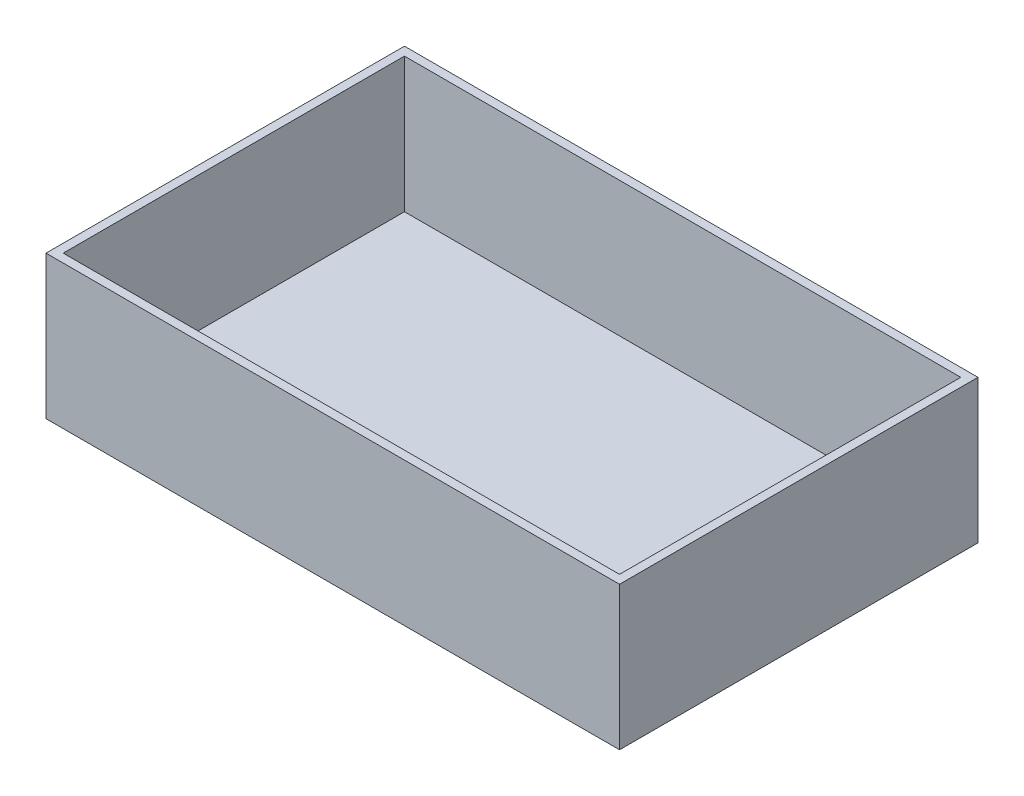
ISO-10303-21;
HEADER;
FILE_DESCRIPTION(('STEP AP214'),'2;1');
FILE_NAME('part.step','',(''),(''),'','','');
FILE_SCHEMA(('AUTOMOTIVE_DESIGN { 1 0 10303 214 1 1 1 1 }'));
ENDSEC;
DATA;
#1=APPLICATION_CONTEXT('core data for automotive mechanical design processes');
#2=APPLICATION_PROTOCOL_DEFINITION('international standard','automotive_design',2000,#1);
#3=PRODUCT_CONTEXT('',#1,'mechanical');
#4=PRODUCT('Part','Part','',(#3));
#5=PRODUCT_RELATED_PRODUCT_CATEGORY('part','',(#4));
#6=PRODUCT_DEFINITION_FORMATION('','',#4);
#7=PRODUCT_DEFINITION_CONTEXT('part definition',#1,'design');
#8=PRODUCT_DEFINITION('design','',#6,#7);
#9=PRODUCT_DEFINITION_SHAPE('','',#8);
#10=(LENGTH_UNIT() NAMED_UNIT(*) SI_UNIT(.MILLI.,.METRE.));
#11=(NAMED_UNIT(*) PLANE_ANGLE_UNIT() SI_UNIT($,.RADIAN.));
#12=(NAMED_UNIT(*) SI_UNIT($,.STERADIAN.) SOLID_ANGLE_UNIT());
#13=UNCERTAINTY_MEASURE_WITH_UNIT(LENGTH_MEASURE(1.E-05),#10,'distance_accuracy_value','');
#14=(GEOMETRIC_REPRESENTATION_CONTEXT(3) GLOBAL_UNCERTAINTY_ASSIGNED_CONTEXT((#13)) GLOBAL_UNIT_ASSIGNED_CONTEXT((#10,
#11,#12)) REPRESENTATION_CONTEXT('',''));
#15=CARTESIAN_POINT('',(0.,0.,0.));
#16=DIRECTION('',(0.,0.,1.));
#17=DIRECTION('',(1.,0.,0.));
#18=AXIS2_PLACEMENT_3D('',#15,#16,#17);
#19=CARTESIAN_POINT('',(0.,0.,0.));
#20=DIRECTION('',(0.,1.,0.));
#21=DIRECTION('',(0.,0.,1.));
#22=AXIS2_PLACEMENT_3D('',#19,#20,#21);
#23=PLANE('',#22);
#24=DIRECTION('',(0.,0.,-1.));
#25=VECTOR('',#24,1.);
#26=CARTESIAN_POINT('',(200.,0.,-125.));
#27=LINE('',#26,#25);
#28=CARTESIAN_POINT('',(200.,0.,125.));
#29=VERTEX_POINT('',#28);
#30=CARTESIAN_POINT('',(200.,0.,-125.));
#31=VERTEX_POINT('',#30);
#32=EDGE_CURVE('E121',#29,#31,#27,.T.);
#33=ORIENTED_EDGE('',*,*,#32,.F.);
#34=DIRECTION('',(1.,0.,0.));
#35=VECTOR('',#34,1.);
#36=CARTESIAN_POINT('',(-200.,0.,125.));
#37=LINE('',#36,#35);
#38=CARTESIAN_POINT('',(-200.,0.,125.));
#39=VERTEX_POINT('',#38);
#40=EDGE_CURVE('E142',#39,#29,#37,.T.);
#41=ORIENTED_EDGE('',*,*,#40,.F.);
#42=DIRECTION('',(0.,0.,1.));
#43=VECTOR('',#42,1.);
#44=CARTESIAN_POINT('',(-200.,0.,-125.));
#45=LINE('',#44,#43);
#46=CARTESIAN_POINT('',(-200.,0.,-125.));
#47=VERTEX_POINT('',#46);
#48=EDGE_CURVE('E153',#47,#39,#45,.T.);
#49=ORIENTED_EDGE('',*,*,#48,.F.);
#50=DIRECTION('',(-1.,0.,0.));
#51=VECTOR('',#50,1.);
#52=CARTESIAN_POINT('',(-200.,0.,-125.));
#53=LINE('',#52,#51);
#54=EDGE_CURVE('E151',#31,#47,#53,.T.);
#55=ORIENTED_EDGE('',*,*,#54,.F.);
#56=EDGE_LOOP('',(#33,#41,#49,#55));
#57=FACE_BOUND('',#56,.T.);
#58=ADVANCED_FACE('F44',(#57),#23,.F.);
#59=CARTESIAN_POINT('',(-194.,100.,-119.));
#60=DIRECTION('',(1.,0.,0.));
#61=DIRECTION('',(0.,0.,-1.));
#62=AXIS2_PLACEMENT_3D('',#59,#60,#61);
#63=PLANE('',#62);
#64=DIRECTION('',(0.,0.,1.));
#65=VECTOR('',#64,1.);
#66=CARTESIAN_POINT('',(-194.,6.,0.));
#67=LINE('',#66,#65);
#68=CARTESIAN_POINT('',(-194.,6.00000000000001,-119.));
#69=VERTEX_POINT('',#68);
#70=CARTESIAN_POINT('',(-194.,6.00000000000001,119.));
#71=VERTEX_POINT('',#70);
#72=EDGE_CURVE('E55',#69,#71,#67,.T.);
#73=ORIENTED_EDGE('',*,*,#72,.F.);
#74=DIRECTION('',(0.,-1.,0.));
#75=VECTOR('',#74,1.);
#76=CARTESIAN_POINT('',(-194.,100.,-119.));
#77=LINE('',#76,#75);
#78=CARTESIAN_POINT('',(-194.,100.,-119.));
#79=VERTEX_POINT('',#78);
#80=EDGE_CURVE('E122',#79,#69,#77,.T.);
#81=ORIENTED_EDGE('',*,*,#80,.F.);
#82=DIRECTION('',(0.,0.,1.));
#83=VECTOR('',#82,1.);
#84=CARTESIAN_POINT('',(-194.,100.,-119.));
#85=LINE('',#84,#83);
#86=CARTESIAN_POINT('',(-194.,100.,119.));
#87=VERTEX_POINT('',#86);
#88=EDGE_CURVE('E130',#79,#87,#85,.T.);
#89=ORIENTED_EDGE('',*,*,#88,.T.);
#90=DIRECTION('',(0.,-1.,0.));
#91=VECTOR('',#90,1.);
#92=CARTESIAN_POINT('',(-194.,100.,119.));
#93=LINE('',#92,#91);
#94=EDGE_CURVE('E133',#87,#71,#93,.T.);
#95=ORIENTED_EDGE('',*,*,#94,.T.);
#96=EDGE_LOOP('',(#73,#81,#89,#95));
#97=FACE_BOUND('',#96,.T.);
#98=ADVANCED_FACE('F175',(#97),#63,.T.);
#99=CARTESIAN_POINT('',(-194.,100.,119.));
#100=DIRECTION('',(0.,0.,-1.));
#101=DIRECTION('',(-1.,0.,0.));
#102=AXIS2_PLACEMENT_3D('',#99,#100,#101);
#103=PLANE('',#102);
#104=DIRECTION('',(1.,0.,0.));
#105=VECTOR('',#104,1.);
#106=CARTESIAN_POINT('',(0.,6.,119.));
#107=LINE('',#106,#105);
#108=CARTESIAN_POINT('',(194.,6.,119.));
#109=VERTEX_POINT('',#108);
#110=EDGE_CURVE('E11',#71,#109,#107,.T.);
#111=ORIENTED_EDGE('',*,*,#110,.F.);
#112=ORIENTED_EDGE('',*,*,#94,.F.);
#113=DIRECTION('',(1.,0.,0.));
#114=VECTOR('',#113,1.);
#115=CARTESIAN_POINT('',(-194.,100.,119.));
#116=LINE('',#115,#114);
#117=CARTESIAN_POINT('',(194.,100.,119.));
#118=VERTEX_POINT('',#117);
#119=EDGE_CURVE('E129',#87,#118,#116,.T.);
#120=ORIENTED_EDGE('',*,*,#119,.T.);
#121=DIRECTION('',(0.,-1.,0.));
#122=VECTOR('',#121,1.);
#123=CARTESIAN_POINT('',(194.,100.,119.));
#124=LINE('',#123,#122);
#125=EDGE_CURVE('E56',#118,#109,#124,.T.);
#126=ORIENTED_EDGE('',*,*,#125,.T.);
#127=EDGE_LOOP('',(#111,#112,#120,#126));
#128=FACE_BOUND('',#127,.T.);
#129=ADVANCED_FACE('F173',(#128),#103,.T.);
#130=CARTESIAN_POINT('',(0.,100.,0.));
#131=DIRECTION('',(0.,1.,0.));
#132=DIRECTION('',(0.,0.,1.));
#133=AXIS2_PLACEMENT_3D('',#130,#131,#132);
#134=PLANE('',#133);
#135=DIRECTION('',(0.,0.,-1.));
#136=VECTOR('',#135,1.);
#137=CARTESIAN_POINT('',(200.,100.,-125.));
#138=LINE('',#137,#136);
#139=CARTESIAN_POINT('',(200.,100.,125.));
#140=VERTEX_POINT('',#139);
#141=CARTESIAN_POINT('',(200.,100.,-125.));
#142=VERTEX_POINT('',#141);
#143=EDGE_CURVE('E139',#140,#142,#138,.T.);
#144=ORIENTED_EDGE('',*,*,#143,.T.);
#145=DIRECTION('',(-1.,0.,0.));
#146=VECTOR('',#145,1.);
#147=CARTESIAN_POINT('',(-200.,100.,-125.));
#148=LINE('',#147,#146);
#149=CARTESIAN_POINT('',(-200.,100.,-125.));
#150=VERTEX_POINT('',#149);
#151=EDGE_CURVE('E143',#142,#150,#148,.T.);
#152=ORIENTED_EDGE('',*,*,#151,.T.);
#153=DIRECTION('',(0.,0.,1.));
#154=VECTOR('',#153,1.);
#155=CARTESIAN_POINT('',(-200.,100.,-125.));
#156=LINE('',#155,#154);
#157=CARTESIAN_POINT('',(-200.,100.,125.));
#158=VERTEX_POINT('',#157);
#159=EDGE_CURVE('E145',#150,#158,#156,.T.);
#160=ORIENTED_EDGE('',*,*,#159,.T.);
#161=DIRECTION('',(1.,0.,0.));
#162=VECTOR('',#161,1.);
#163=CARTESIAN_POINT('',(-200.,100.,125.));
#164=LINE('',#163,#162);
#165=EDGE_CURVE('E148',#158,#140,#164,.T.);
#166=ORIENTED_EDGE('',*,*,#165,.T.);
#167=EDGE_LOOP('',(#144,#152,#160,#166));
#168=FACE_BOUND('',#167,.T.);
#169=DIRECTION('',(-1.,0.,0.));
#170=VECTOR('',#169,1.);
#171=CARTESIAN_POINT('',(-194.,100.,-119.));
#172=LINE('',#171,#170);
#173=CARTESIAN_POINT('',(194.,100.,-119.));
#174=VERTEX_POINT('',#173);
#175=EDGE_CURVE('E116',#174,#79,#172,.T.);
#176=ORIENTED_EDGE('',*,*,#175,.F.);
#177=DIRECTION('',(0.,0.,-1.));
#178=VECTOR('',#177,1.);
#179=CARTESIAN_POINT('',(194.,100.,-119.));
#180=LINE('',#179,#178);
#181=EDGE_CURVE('E109',#118,#174,#180,.T.);
#182=ORIENTED_EDGE('',*,*,#181,.F.);
#183=ORIENTED_EDGE('',*,*,#119,.F.);
#184=ORIENTED_EDGE('',*,*,#88,.F.);
#185=EDGE_LOOP('',(#176,#182,#183,#184));
#186=FACE_BOUND('',#185,.T.);
#187=ADVANCED_FACE('F125',(#168,#186),#134,.T.);
#188=CARTESIAN_POINT('',(200.,100.,-125.));
#189=DIRECTION('',(-1.,0.,0.));
#190=DIRECTION('',(0.,0.,1.));
#191=AXIS2_PLACEMENT_3D('',#188,#189,#190);
#192=PLANE('',#191);
#193=ORIENTED_EDGE('',*,*,#32,.T.);
#194=DIRECTION('',(0.,-1.,0.));
#195=VECTOR('',#194,1.);
#196=CARTESIAN_POINT('',(200.,100.,-125.));
#197=LINE('',#196,#195);
#198=EDGE_CURVE('E163',#142,#31,#197,.T.);
#199=ORIENTED_EDGE('',*,*,#198,.F.);
#200=ORIENTED_EDGE('',*,*,#143,.F.);
#201=DIRECTION('',(0.,-1.,0.));
#202=VECTOR('',#201,1.);
#203=CARTESIAN_POINT('',(200.,100.,125.));
#204=LINE('',#203,#202);
#205=EDGE_CURVE('E146',#140,#29,#204,.T.);
#206=ORIENTED_EDGE('',*,*,#205,.T.);
#207=EDGE_LOOP('',(#193,#199,#200,#206));
#208=FACE_BOUND('',#207,.T.);
#209=ADVANCED_FACE('F182',(#208),#192,.F.);
#210=CARTESIAN_POINT('',(-200.,100.,-125.));
#211=DIRECTION('',(0.,0.,1.));
#212=DIRECTION('',(1.,0.,0.));
#213=AXIS2_PLACEMENT_3D('',#210,#211,#212);
#214=PLANE('',#213);
#215=ORIENTED_EDGE('',*,*,#54,.T.);
#216=DIRECTION('',(0.,-1.,0.));
#217=VECTOR('',#216,1.);
#218=CARTESIAN_POINT('',(-200.,100.,-125.));
#219=LINE('',#218,#217);
#220=EDGE_CURVE('E161',#150,#47,#219,.T.);
#221=ORIENTED_EDGE('',*,*,#220,.F.);
#222=ORIENTED_EDGE('',*,*,#151,.F.);
#223=ORIENTED_EDGE('',*,*,#198,.T.);
#224=EDGE_LOOP('',(#215,#221,#222,#223));
#225=FACE_BOUND('',#224,.T.);
#226=ADVANCED_FACE('F202',(#225),#214,.F.);
#227=CARTESIAN_POINT('',(-200.,100.,-125.));
#228=DIRECTION('',(1.,0.,0.));
#229=DIRECTION('',(0.,0.,-1.));
#230=AXIS2_PLACEMENT_3D('',#227,#228,#229);
#231=PLANE('',#230);
#232=ORIENTED_EDGE('',*,*,#48,.T.);
#233=DIRECTION('',(0.,-1.,0.));
#234=VECTOR('',#233,1.);
#235=CARTESIAN_POINT('',(-200.,100.,125.));
#236=LINE('',#235,#234);
#237=EDGE_CURVE('E158',#158,#39,#236,.T.);
#238=ORIENTED_EDGE('',*,*,#237,.F.);
#239=ORIENTED_EDGE('',*,*,#159,.F.);
#240=ORIENTED_EDGE('',*,*,#220,.T.);
#241=EDGE_LOOP('',(#232,#238,#239,#240));
#242=FACE_BOUND('',#241,.T.);
#243=ADVANCED_FACE('F205',(#242),#231,.F.);
#244=CARTESIAN_POINT('',(-200.,100.,125.));
#245=DIRECTION('',(0.,0.,-1.));
#246=DIRECTION('',(-1.,0.,0.));
#247=AXIS2_PLACEMENT_3D('',#244,#245,#246);
#248=PLANE('',#247);
#249=ORIENTED_EDGE('',*,*,#40,.T.);
#250=ORIENTED_EDGE('',*,*,#205,.F.);
#251=ORIENTED_EDGE('',*,*,#165,.F.);
#252=ORIENTED_EDGE('',*,*,#237,.T.);
#253=EDGE_LOOP('',(#249,#250,#251,#252));
#254=FACE_BOUND('',#253,.T.);
#255=ADVANCED_FACE('F196',(#254),#248,.F.);
#256=CARTESIAN_POINT('',(194.,100.,-119.));
#257=DIRECTION('',(-1.,0.,0.));
#258=DIRECTION('',(0.,0.,1.));
#259=AXIS2_PLACEMENT_3D('',#256,#257,#258);
#260=PLANE('',#259);
#261=DIRECTION('',(0.,-1.,0.));
#262=VECTOR('',#261,1.);
#263=CARTESIAN_POINT('',(194.,100.,-119.));
#264=LINE('',#263,#262);
#265=CARTESIAN_POINT('',(194.,6.00000000000001,-119.));
#266=VERTEX_POINT('',#265);
#267=EDGE_CURVE('E115',#174,#266,#264,.T.);
#268=ORIENTED_EDGE('',*,*,#267,.T.);
#269=DIRECTION('',(0.,0.,1.));
#270=VECTOR('',#269,1.);
#271=CARTESIAN_POINT('',(194.,6.,0.));
#272=LINE('',#271,#270);
#273=EDGE_CURVE('E170',#266,#109,#272,.T.);
#274=ORIENTED_EDGE('',*,*,#273,.T.);
#275=ORIENTED_EDGE('',*,*,#125,.F.);
#276=ORIENTED_EDGE('',*,*,#181,.T.);
#277=EDGE_LOOP('',(#268,#274,#275,#276));
#278=FACE_BOUND('',#277,.T.);
#279=ADVANCED_FACE('F112',(#278),#260,.T.);
#280=CARTESIAN_POINT('',(-194.,100.,-119.));
#281=DIRECTION('',(0.,0.,1.));
#282=DIRECTION('',(1.,0.,0.));
#283=AXIS2_PLACEMENT_3D('',#280,#281,#282);
#284=PLANE('',#283);
#285=ORIENTED_EDGE('',*,*,#80,.T.);
#286=DIRECTION('',(1.,0.,0.));
#287=VECTOR('',#286,1.);
#288=CARTESIAN_POINT('',(0.,6.,-119.));
#289=LINE('',#288,#287);
#290=EDGE_CURVE('E67',#69,#266,#289,.T.);
#291=ORIENTED_EDGE('',*,*,#290,.T.);
#292=ORIENTED_EDGE('',*,*,#267,.F.);
#293=ORIENTED_EDGE('',*,*,#175,.T.);
#294=EDGE_LOOP('',(#285,#291,#292,#293));
#295=FACE_BOUND('',#294,.T.);
#296=ADVANCED_FACE('F118',(#295),#284,.T.);
#297=CARTESIAN_POINT('',(0.,6.,0.));
#298=DIRECTION('',(0.,1.,0.));
#299=DIRECTION('',(0.,0.,1.));
#300=AXIS2_PLACEMENT_3D('',#297,#298,#299);
#301=PLANE('',#300);
#302=ORIENTED_EDGE('',*,*,#273,.F.);
#303=ORIENTED_EDGE('',*,*,#290,.F.);
#304=ORIENTED_EDGE('',*,*,#72,.T.);
#305=ORIENTED_EDGE('',*,*,#110,.T.);
#306=EDGE_LOOP('',(#302,#303,#304,#305));
#307=FACE_BOUND('',#306,.T.);
#308=ADVANCED_FACE('F174',(#307),#301,.T.);
#309=CLOSED_SHELL('',(#58,#98,#129,#187,#209,#226,#243,#255,#279,#296,#308));
#310=MANIFOLD_SOLID_BREP('B2',#309);
#311=ADVANCED_BREP_SHAPE_REPRESENTATION('',(#18,#310),#14);
#312=SHAPE_DEFINITION_REPRESENTATION(#9,#311);
ENDSEC;
END-ISO-10303-21;
